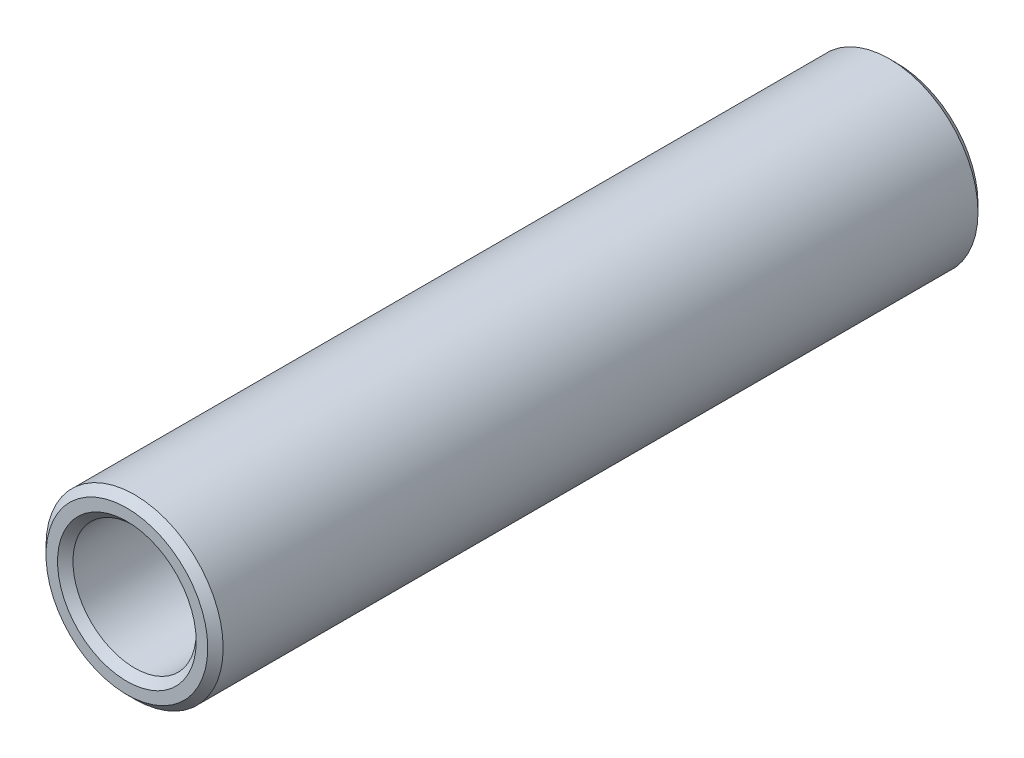
ISO-10303-21;
HEADER;
FILE_DESCRIPTION(('STEP AP214'),'2;1');
FILE_NAME('part.step','',(''),(''),'','','');
FILE_SCHEMA(('AUTOMOTIVE_DESIGN { 1 0 10303 214 1 1 1 1 }'));
ENDSEC;
DATA;
#1=APPLICATION_CONTEXT('core data for automotive mechanical design processes');
#2=APPLICATION_PROTOCOL_DEFINITION('international standard','automotive_design',2000,#1);
#3=PRODUCT_CONTEXT('',#1,'mechanical');
#4=PRODUCT('Part','Part','',(#3));
#5=PRODUCT_RELATED_PRODUCT_CATEGORY('part','',(#4));
#6=PRODUCT_DEFINITION_FORMATION('','',#4);
#7=PRODUCT_DEFINITION_CONTEXT('part definition',#1,'design');
#8=PRODUCT_DEFINITION('design','',#6,#7);
#9=PRODUCT_DEFINITION_SHAPE('','',#8);
#10=(LENGTH_UNIT() NAMED_UNIT(*) SI_UNIT(.MILLI.,.METRE.));
#11=(NAMED_UNIT(*) PLANE_ANGLE_UNIT() SI_UNIT($,.RADIAN.));
#12=(NAMED_UNIT(*) SI_UNIT($,.STERADIAN.) SOLID_ANGLE_UNIT());
#13=UNCERTAINTY_MEASURE_WITH_UNIT(LENGTH_MEASURE(1.E-05),#10,'distance_accuracy_value','');
#14=(GEOMETRIC_REPRESENTATION_CONTEXT(3) GLOBAL_UNCERTAINTY_ASSIGNED_CONTEXT((#13)) GLOBAL_UNIT_ASSIGNED_CONTEXT((#10,
#11,#12)) REPRESENTATION_CONTEXT('',''));
#15=CARTESIAN_POINT('',(0.,0.,0.));
#16=DIRECTION('',(0.,0.,1.));
#17=DIRECTION('',(1.,0.,0.));
#18=AXIS2_PLACEMENT_3D('',#15,#16,#17);
#19=CARTESIAN_POINT('',(0.,0.,100.));
#20=DIRECTION('',(0.,0.,1.));
#21=DIRECTION('',(1.,0.,0.));
#22=AXIS2_PLACEMENT_3D('',#19,#20,#21);
#23=PLANE('',#22);
#24=CARTESIAN_POINT('',(0.,0.,100.));
#25=DIRECTION('',(0.,0.,1.));
#26=DIRECTION('',(1.,0.,0.));
#27=AXIS2_PLACEMENT_3D('',#24,#25,#26);
#28=CIRCLE('',#27,9.00000000000002);
#29=CARTESIAN_POINT('',(9.00000000000002,0.,100.));
#30=VERTEX_POINT('',#29);
#31=EDGE_CURVE('E51',#30,#30,#28,.F.);
#32=ORIENTED_EDGE('',*,*,#31,.T.);
#33=EDGE_LOOP('',(#32));
#34=FACE_BOUND('',#33,.T.);
#35=CARTESIAN_POINT('',(0.,0.,100.));
#36=DIRECTION('',(0.,0.,1.));
#37=DIRECTION('',(1.,0.,0.));
#38=AXIS2_PLACEMENT_3D('',#35,#36,#37);
#39=CIRCLE('',#38,10.5);
#40=CARTESIAN_POINT('',(10.5,0.,100.));
#41=VERTEX_POINT('',#40);
#42=EDGE_CURVE('E55',#41,#41,#39,.T.);
#43=ORIENTED_EDGE('',*,*,#42,.T.);
#44=EDGE_LOOP('',(#43));
#45=FACE_BOUND('',#44,.T.);
#46=ADVANCED_FACE('F39',(#34,#45),#23,.T.);
#47=CARTESIAN_POINT('',(0.,0.,0.));
#48=DIRECTION('',(0.,0.,1.));
#49=DIRECTION('',(1.,0.,0.));
#50=AXIS2_PLACEMENT_3D('',#47,#48,#49);
#51=PLANE('',#50);
#52=CARTESIAN_POINT('',(0.,0.,0.));
#53=DIRECTION('',(0.,0.,1.));
#54=DIRECTION('',(1.,0.,0.));
#55=AXIS2_PLACEMENT_3D('',#52,#53,#54);
#56=CIRCLE('',#55,8.99999999999999);
#57=CARTESIAN_POINT('',(8.99999999999999,0.,0.));
#58=VERTEX_POINT('',#57);
#59=EDGE_CURVE('E66',#58,#58,#56,.T.);
#60=ORIENTED_EDGE('',*,*,#59,.T.);
#61=EDGE_LOOP('',(#60));
#62=FACE_BOUND('',#61,.T.);
#63=CARTESIAN_POINT('',(0.,0.,0.));
#64=DIRECTION('',(0.,0.,1.));
#65=DIRECTION('',(1.,0.,0.));
#66=AXIS2_PLACEMENT_3D('',#63,#64,#65);
#67=CIRCLE('',#66,10.5);
#68=CARTESIAN_POINT('',(10.5,0.,0.));
#69=VERTEX_POINT('',#68);
#70=EDGE_CURVE('E69',#69,#69,#67,.F.);
#71=ORIENTED_EDGE('',*,*,#70,.T.);
#72=EDGE_LOOP('',(#71));
#73=FACE_BOUND('',#72,.T.);
#74=ADVANCED_FACE('F73',(#62,#73),#51,.F.);
#75=CARTESIAN_POINT('',(0.,0.,100.));
#76=DIRECTION('',(0.,0.,-1.));
#77=DIRECTION('',(-1.,0.,0.));
#78=AXIS2_PLACEMENT_3D('',#75,#76,#77);
#79=CYLINDRICAL_SURFACE('',#78,11.5);
#80=CARTESIAN_POINT('',(0.,0.,1.));
#81=DIRECTION('',(0.,0.,1.));
#82=DIRECTION('',(1.,0.,0.));
#83=AXIS2_PLACEMENT_3D('',#80,#81,#82);
#84=CIRCLE('',#83,11.5);
#85=CARTESIAN_POINT('',(11.5,0.,1.));
#86=VERTEX_POINT('',#85);
#87=EDGE_CURVE('E10',#86,#86,#84,.T.);
#88=ORIENTED_EDGE('',*,*,#87,.T.);
#89=EDGE_LOOP('',(#88));
#90=FACE_BOUND('',#89,.T.);
#91=CARTESIAN_POINT('',(0.,0.,99.));
#92=DIRECTION('',(0.,0.,1.));
#93=DIRECTION('',(1.,0.,0.));
#94=AXIS2_PLACEMENT_3D('',#91,#92,#93);
#95=CIRCLE('',#94,11.5);
#96=CARTESIAN_POINT('',(11.5,0.,99.));
#97=VERTEX_POINT('',#96);
#98=EDGE_CURVE('E47',#97,#97,#95,.F.);
#99=ORIENTED_EDGE('',*,*,#98,.T.);
#100=EDGE_LOOP('',(#99));
#101=FACE_BOUND('',#100,.T.);
#102=ADVANCED_FACE('F94',(#90,#101),#79,.T.);
#103=CARTESIAN_POINT('',(0.,0.,100.));
#104=DIRECTION('',(0.,0.,-1.));
#105=DIRECTION('',(-1.,0.,0.));
#106=AXIS2_PLACEMENT_3D('',#103,#104,#105);
#107=CYLINDRICAL_SURFACE('',#106,8.);
#108=CARTESIAN_POINT('',(0.,0.,1.));
#109=DIRECTION('',(0.,0.,1.));
#110=DIRECTION('',(1.,0.,0.));
#111=AXIS2_PLACEMENT_3D('',#108,#109,#110);
#112=CIRCLE('',#111,8.);
#113=CARTESIAN_POINT('',(8.,0.,1.));
#114=VERTEX_POINT('',#113);
#115=EDGE_CURVE('E60',#114,#114,#112,.F.);
#116=ORIENTED_EDGE('',*,*,#115,.T.);
#117=EDGE_LOOP('',(#116));
#118=FACE_BOUND('',#117,.T.);
#119=CARTESIAN_POINT('',(0.,0.,99.));
#120=DIRECTION('',(0.,0.,1.));
#121=DIRECTION('',(1.,0.,0.));
#122=AXIS2_PLACEMENT_3D('',#119,#120,#121);
#123=CIRCLE('',#122,8.);
#124=CARTESIAN_POINT('',(8.,0.,99.));
#125=VERTEX_POINT('',#124);
#126=EDGE_CURVE('E63',#125,#125,#123,.T.);
#127=ORIENTED_EDGE('',*,*,#126,.T.);
#128=EDGE_LOOP('',(#127));
#129=FACE_BOUND('',#128,.T.);
#130=ADVANCED_FACE('F99',(#118,#129),#107,.F.);
#131=CARTESIAN_POINT('',(0.,0.,0.));
#132=DIRECTION('',(0.,0.,-1.));
#133=DIRECTION('',(-1.,0.,0.));
#134=AXIS2_PLACEMENT_3D('',#131,#132,#133);
#135=CONICAL_SURFACE('',#134,8.99999999999999,0.785398163397445);
#136=ORIENTED_EDGE('',*,*,#115,.F.);
#137=EDGE_LOOP('',(#136));
#138=FACE_BOUND('',#137,.T.);
#139=ORIENTED_EDGE('',*,*,#59,.F.);
#140=EDGE_LOOP('',(#139));
#141=FACE_BOUND('',#140,.T.);
#142=ADVANCED_FACE('F84',(#138,#141),#135,.F.);
#143=CARTESIAN_POINT('',(0.,0.,99.));
#144=DIRECTION('',(0.,0.,1.));
#145=DIRECTION('',(1.,0.,0.));
#146=AXIS2_PLACEMENT_3D('',#143,#144,#145);
#147=CONICAL_SURFACE('',#146,8.,0.785398163397445);
#148=ORIENTED_EDGE('',*,*,#31,.F.);
#149=EDGE_LOOP('',(#148));
#150=FACE_BOUND('',#149,.T.);
#151=ORIENTED_EDGE('',*,*,#126,.F.);
#152=EDGE_LOOP('',(#151));
#153=FACE_BOUND('',#152,.T.);
#154=ADVANCED_FACE('F78',(#150,#153),#147,.F.);
#155=CARTESIAN_POINT('',(0.,0.,1.));
#156=DIRECTION('',(0.,0.,1.));
#157=DIRECTION('',(1.,0.,0.));
#158=AXIS2_PLACEMENT_3D('',#155,#156,#157);
#159=CONICAL_SURFACE('',#158,11.5,0.785398163397451);
#160=ORIENTED_EDGE('',*,*,#70,.F.);
#161=EDGE_LOOP('',(#160));
#162=FACE_BOUND('',#161,.T.);
#163=ORIENTED_EDGE('',*,*,#87,.F.);
#164=EDGE_LOOP('',(#163));
#165=FACE_BOUND('',#164,.T.);
#166=ADVANCED_FACE('F75',(#162,#165),#159,.T.);
#167=CARTESIAN_POINT('',(0.,0.,100.));
#168=DIRECTION('',(0.,0.,-1.));
#169=DIRECTION('',(-1.,0.,0.));
#170=AXIS2_PLACEMENT_3D('',#167,#168,#169);
#171=CONICAL_SURFACE('',#170,10.5,0.785398163397451);
#172=ORIENTED_EDGE('',*,*,#98,.F.);
#173=EDGE_LOOP('',(#172));
#174=FACE_BOUND('',#173,.T.);
#175=ORIENTED_EDGE('',*,*,#42,.F.);
#176=EDGE_LOOP('',(#175));
#177=FACE_BOUND('',#176,.T.);
#178=ADVANCED_FACE('F42',(#174,#177),#171,.T.);
#179=CLOSED_SHELL('',(#46,#74,#102,#130,#142,#154,#166,#178));
#180=MANIFOLD_SOLID_BREP('B2',#179);
#181=ADVANCED_BREP_SHAPE_REPRESENTATION('',(#18,#180),#14);
#182=SHAPE_DEFINITION_REPRESENTATION(#9,#181);
ENDSEC;
END-ISO-10303-21;
